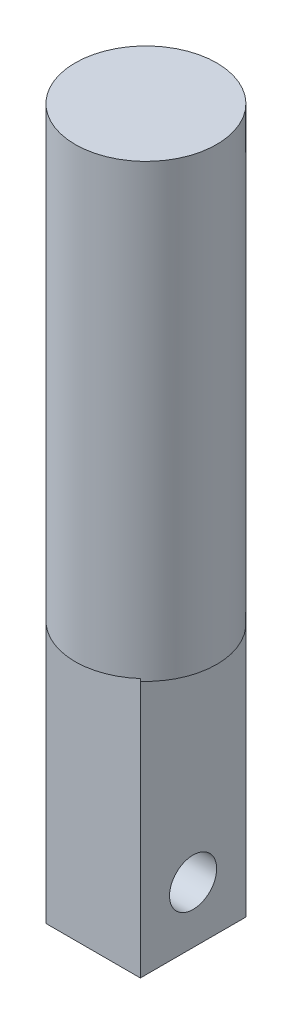
ISO-10303-21;
HEADER;
FILE_DESCRIPTION(('STEP AP214'),'2;1');
FILE_NAME('part.step','',(''),(''),'','','');
FILE_SCHEMA(('AUTOMOTIVE_DESIGN { 1 0 10303 214 1 1 1 1 }'));
ENDSEC;
DATA;
#1=APPLICATION_CONTEXT('core data for automotive mechanical design processes');
#2=APPLICATION_PROTOCOL_DEFINITION('international standard','automotive_design',2000,#1);
#3=PRODUCT_CONTEXT('',#1,'mechanical');
#4=PRODUCT('Part','Part','',(#3));
#5=PRODUCT_RELATED_PRODUCT_CATEGORY('part','',(#4));
#6=PRODUCT_DEFINITION_FORMATION('','',#4);
#7=PRODUCT_DEFINITION_CONTEXT('part definition',#1,'design');
#8=PRODUCT_DEFINITION('design','',#6,#7);
#9=PRODUCT_DEFINITION_SHAPE('','',#8);
#10=(LENGTH_UNIT() NAMED_UNIT(*) SI_UNIT(.MILLI.,.METRE.));
#11=(NAMED_UNIT(*) PLANE_ANGLE_UNIT() SI_UNIT($,.RADIAN.));
#12=(NAMED_UNIT(*) SI_UNIT($,.STERADIAN.) SOLID_ANGLE_UNIT());
#13=UNCERTAINTY_MEASURE_WITH_UNIT(LENGTH_MEASURE(1.E-05),#10,'distance_accuracy_value','');
#14=(GEOMETRIC_REPRESENTATION_CONTEXT(3) GLOBAL_UNCERTAINTY_ASSIGNED_CONTEXT((#13)) GLOBAL_UNIT_ASSIGNED_CONTEXT((#10,
#11,#12)) REPRESENTATION_CONTEXT('',''));
#15=CARTESIAN_POINT('',(0.,0.,0.));
#16=DIRECTION('',(0.,0.,1.));
#17=DIRECTION('',(1.,0.,0.));
#18=AXIS2_PLACEMENT_3D('',#15,#16,#17);
#19=CARTESIAN_POINT('',(0.,150.,0.));
#20=DIRECTION('',(0.,-1.,0.));
#21=DIRECTION('',(0.,0.,-1.));
#22=AXIS2_PLACEMENT_3D('',#19,#20,#21);
#23=CYLINDRICAL_SURFACE('',#22,15.);
#24=CARTESIAN_POINT('',(0.,150.,0.));
#25=DIRECTION('',(0.,1.,0.));
#26=DIRECTION('',(0.,0.,1.));
#27=AXIS2_PLACEMENT_3D('',#24,#25,#26);
#28=CIRCLE('',#27,15.);
#29=CARTESIAN_POINT('',(0.,150.,15.));
#30=VERTEX_POINT('',#29);
#31=EDGE_CURVE('E161',#30,#30,#28,.T.);
#32=ORIENTED_EDGE('',*,*,#31,.F.);
#33=EDGE_LOOP('',(#32));
#34=FACE_BOUND('',#33,.T.);
#35=CARTESIAN_POINT('',(0.,55.,0.));
#36=DIRECTION('',(0.,-1.,0.));
#37=DIRECTION('',(0.,0.,-1.));
#38=AXIS2_PLACEMENT_3D('',#35,#36,#37);
#39=CIRCLE('',#38,15.);
#40=CARTESIAN_POINT('',(-10.,55.,-11.1803398874989));
#41=VERTEX_POINT('',#40);
#42=CARTESIAN_POINT('',(10.,55.,-11.1803398874989));
#43=VERTEX_POINT('',#42);
#44=EDGE_CURVE('E97',#41,#43,#39,.T.);
#45=ORIENTED_EDGE('',*,*,#44,.F.);
#46=DIRECTION('',(0.,-1.,0.));
#47=VECTOR('',#46,1.);
#48=CARTESIAN_POINT('',(-10.,55.,-11.1803398874989));
#49=LINE('',#48,#47);
#50=CARTESIAN_POINT('',(-10.,54.4943570603394,-11.1803398874989));
#51=VERTEX_POINT('',#50);
#52=EDGE_CURVE('E109',#41,#51,#49,.T.);
#53=ORIENTED_EDGE('',*,*,#52,.T.);
#54=CARTESIAN_POINT('',(0.,54.4943570603394,0.));
#55=DIRECTION('',(0.,1.,0.));
#56=DIRECTION('',(0.,0.,1.));
#57=AXIS2_PLACEMENT_3D('',#54,#55,#56);
#58=CIRCLE('',#57,15.);
#59=CARTESIAN_POINT('',(-10.,54.4943570603394,11.1803398874989));
#60=VERTEX_POINT('',#59);
#61=EDGE_CURVE('E11',#51,#60,#58,.T.);
#62=ORIENTED_EDGE('',*,*,#61,.T.);
#63=DIRECTION('',(0.,-1.,0.));
#64=VECTOR('',#63,1.);
#65=CARTESIAN_POINT('',(-10.,55.,11.1803398874989));
#66=LINE('',#65,#64);
#67=CARTESIAN_POINT('',(-10.,55.,11.1803398874989));
#68=VERTEX_POINT('',#67);
#69=EDGE_CURVE('E66',#68,#60,#66,.T.);
#70=ORIENTED_EDGE('',*,*,#69,.F.);
#71=CARTESIAN_POINT('',(0.,55.,0.));
#72=DIRECTION('',(0.,-1.,0.));
#73=DIRECTION('',(0.,0.,-1.));
#74=AXIS2_PLACEMENT_3D('',#71,#72,#73);
#75=CIRCLE('',#74,15.);
#76=CARTESIAN_POINT('',(10.,55.,11.1803398874989));
#77=VERTEX_POINT('',#76);
#78=EDGE_CURVE('E132',#77,#68,#75,.T.);
#79=ORIENTED_EDGE('',*,*,#78,.F.);
#80=DIRECTION('',(0.,-1.,0.));
#81=VECTOR('',#80,1.);
#82=CARTESIAN_POINT('',(10.,55.,11.1803398874989));
#83=LINE('',#82,#81);
#84=CARTESIAN_POINT('',(10.,54.4943570603394,11.1803398874989));
#85=VERTEX_POINT('',#84);
#86=EDGE_CURVE('E126',#77,#85,#83,.T.);
#87=ORIENTED_EDGE('',*,*,#86,.T.);
#88=CARTESIAN_POINT('',(0.,54.4943570603394,0.));
#89=DIRECTION('',(0.,-1.,0.));
#90=DIRECTION('',(0.,0.,-1.));
#91=AXIS2_PLACEMENT_3D('',#88,#89,#90);
#92=CIRCLE('',#91,15.);
#93=CARTESIAN_POINT('',(10.,54.4943570603394,-11.1803398874989));
#94=VERTEX_POINT('',#93);
#95=EDGE_CURVE('E115',#94,#85,#92,.T.);
#96=ORIENTED_EDGE('',*,*,#95,.F.);
#97=DIRECTION('',(0.,-1.,0.));
#98=VECTOR('',#97,1.);
#99=CARTESIAN_POINT('',(10.,55.,-11.1803398874989));
#100=LINE('',#99,#98);
#101=EDGE_CURVE('E107',#43,#94,#100,.T.);
#102=ORIENTED_EDGE('',*,*,#101,.F.);
#103=EDGE_LOOP('',(#45,#53,#62,#70,#79,#87,#96,#102));
#104=FACE_BOUND('',#103,.T.);
#105=ADVANCED_FACE('F42',(#34,#104),#23,.T.);
#106=CARTESIAN_POINT('',(0.,0.,0.));
#107=DIRECTION('',(0.,1.,0.));
#108=DIRECTION('',(0.,0.,1.));
#109=AXIS2_PLACEMENT_3D('',#106,#107,#108);
#110=PLANE('',#109);
#111=DIRECTION('',(0.,0.,1.));
#112=VECTOR('',#111,1.);
#113=CARTESIAN_POINT('',(-10.,0.,0.));
#114=LINE('',#113,#112);
#115=CARTESIAN_POINT('',(-10.,0.,-11.1803398874989));
#116=VERTEX_POINT('',#115);
#117=CARTESIAN_POINT('',(-10.,0.,11.1803398874989));
#118=VERTEX_POINT('',#117);
#119=EDGE_CURVE('E51',#116,#118,#114,.T.);
#120=ORIENTED_EDGE('',*,*,#119,.F.);
#121=DIRECTION('',(-1.,0.,0.));
#122=VECTOR('',#121,1.);
#123=CARTESIAN_POINT('',(-10.,0.,-11.1803398874989));
#124=LINE('',#123,#122);
#125=CARTESIAN_POINT('',(10.,0.,-11.1803398874989));
#126=VERTEX_POINT('',#125);
#127=EDGE_CURVE('E58',#126,#116,#124,.T.);
#128=ORIENTED_EDGE('',*,*,#127,.F.);
#129=DIRECTION('',(0.,0.,1.));
#130=VECTOR('',#129,1.);
#131=CARTESIAN_POINT('',(10.,0.,0.));
#132=LINE('',#131,#130);
#133=CARTESIAN_POINT('',(10.,0.,11.1803398874989));
#134=VERTEX_POINT('',#133);
#135=EDGE_CURVE('E165',#126,#134,#132,.T.);
#136=ORIENTED_EDGE('',*,*,#135,.T.);
#137=DIRECTION('',(1.,0.,0.));
#138=VECTOR('',#137,1.);
#139=CARTESIAN_POINT('',(-10.,0.,11.1803398874989));
#140=LINE('',#139,#138);
#141=EDGE_CURVE('E129',#118,#134,#140,.T.);
#142=ORIENTED_EDGE('',*,*,#141,.F.);
#143=EDGE_LOOP('',(#120,#128,#136,#142));
#144=FACE_BOUND('',#143,.T.);
#145=ADVANCED_FACE('F179',(#144),#110,.F.);
#146=CARTESIAN_POINT('',(0.,150.,0.));
#147=DIRECTION('',(0.,1.,0.));
#148=DIRECTION('',(0.,0.,1.));
#149=AXIS2_PLACEMENT_3D('',#146,#147,#148);
#150=PLANE('',#149);
#151=ORIENTED_EDGE('',*,*,#31,.T.);
#152=EDGE_LOOP('',(#151));
#153=FACE_BOUND('',#152,.T.);
#154=ADVANCED_FACE('F189',(#153),#150,.T.);
#155=CARTESIAN_POINT('',(110.,54.4943570603394,15.));
#156=DIRECTION('',(0.,-1.,0.));
#157=DIRECTION('',(0.,0.,-1.));
#158=AXIS2_PLACEMENT_3D('',#155,#156,#157);
#159=PLANE('',#158);
#160=ORIENTED_EDGE('',*,*,#95,.T.);
#161=DIRECTION('',(0.,0.,1.));
#162=VECTOR('',#161,1.);
#163=CARTESIAN_POINT('',(10.,54.4943570603394,15.));
#164=LINE('',#163,#162);
#165=EDGE_CURVE('E151',#94,#85,#164,.T.);
#166=ORIENTED_EDGE('',*,*,#165,.F.);
#167=EDGE_LOOP('',(#160,#166));
#168=FACE_BOUND('',#167,.T.);
#169=ADVANCED_FACE('F187',(#168),#159,.T.);
#170=CARTESIAN_POINT('',(10.,0.,0.));
#171=DIRECTION('',(-1.,0.,0.));
#172=DIRECTION('',(0.,0.,1.));
#173=AXIS2_PLACEMENT_3D('',#170,#171,#172);
#174=PLANE('',#173);
#175=CARTESIAN_POINT('',(10.,12.,-0.000339887498942634));
#176=DIRECTION('',(1.,0.,0.));
#177=DIRECTION('',(0.,0.,-1.));
#178=AXIS2_PLACEMENT_3D('',#175,#176,#177);
#179=CIRCLE('',#178,5.);
#180=CARTESIAN_POINT('',(10.,12.,-5.00033988749895));
#181=VERTEX_POINT('',#180);
#182=EDGE_CURVE('E119',#181,#181,#179,.T.);
#183=ORIENTED_EDGE('',*,*,#182,.F.);
#184=EDGE_LOOP('',(#183));
#185=FACE_BOUND('',#184,.T.);
#186=ORIENTED_EDGE('',*,*,#165,.T.);
#187=DIRECTION('',(0.,-1.,0.));
#188=VECTOR('',#187,1.);
#189=CARTESIAN_POINT('',(10.,150.,11.1803398874989));
#190=LINE('',#189,#188);
#191=EDGE_CURVE('E155',#134,#85,#190,.F.);
#192=ORIENTED_EDGE('',*,*,#191,.F.);
#193=ORIENTED_EDGE('',*,*,#135,.F.);
#194=DIRECTION('',(0.,-1.,0.));
#195=VECTOR('',#194,1.);
#196=CARTESIAN_POINT('',(10.,150.,-11.1803398874989));
#197=LINE('',#196,#195);
#198=EDGE_CURVE('E158',#94,#126,#197,.T.);
#199=ORIENTED_EDGE('',*,*,#198,.F.);
#200=EDGE_LOOP('',(#186,#192,#193,#199));
#201=FACE_BOUND('',#200,.T.);
#202=ADVANCED_FACE('F184',(#185,#201),#174,.F.);
#203=CARTESIAN_POINT('',(-110.,54.4943570603394,15.));
#204=DIRECTION('',(0.,1.,0.));
#205=DIRECTION('',(0.,0.,1.));
#206=AXIS2_PLACEMENT_3D('',#203,#204,#205);
#207=PLANE('',#206);
#208=DIRECTION('',(0.,0.,1.));
#209=VECTOR('',#208,1.);
#210=CARTESIAN_POINT('',(-10.,54.4943570603394,15.));
#211=LINE('',#210,#209);
#212=EDGE_CURVE('E141',#51,#60,#211,.T.);
#213=ORIENTED_EDGE('',*,*,#212,.T.);
#214=ORIENTED_EDGE('',*,*,#61,.F.);
#215=EDGE_LOOP('',(#213,#214));
#216=FACE_BOUND('',#215,.T.);
#217=ADVANCED_FACE('F195',(#216),#207,.F.);
#218=CARTESIAN_POINT('',(-10.,0.,0.));
#219=DIRECTION('',(-1.,0.,0.));
#220=DIRECTION('',(0.,0.,1.));
#221=AXIS2_PLACEMENT_3D('',#218,#219,#220);
#222=PLANE('',#221);
#223=CARTESIAN_POINT('',(-9.99999999999999,12.,-0.000339887498942634));
#224=DIRECTION('',(-1.,0.,0.));
#225=DIRECTION('',(0.,0.,1.));
#226=AXIS2_PLACEMENT_3D('',#223,#224,#225);
#227=CIRCLE('',#226,5.);
#228=CARTESIAN_POINT('',(-9.99999999999999,12.,4.99966011250106));
#229=VERTEX_POINT('',#228);
#230=EDGE_CURVE('E45',#229,#229,#227,.T.);
#231=ORIENTED_EDGE('',*,*,#230,.F.);
#232=EDGE_LOOP('',(#231));
#233=FACE_BOUND('',#232,.T.);
#234=DIRECTION('',(0.,-1.,0.));
#235=VECTOR('',#234,1.);
#236=CARTESIAN_POINT('',(-10.,150.,-11.1803398874989));
#237=LINE('',#236,#235);
#238=EDGE_CURVE('E148',#51,#116,#237,.T.);
#239=ORIENTED_EDGE('',*,*,#238,.T.);
#240=ORIENTED_EDGE('',*,*,#119,.T.);
#241=DIRECTION('',(0.,-1.,0.));
#242=VECTOR('',#241,1.);
#243=CARTESIAN_POINT('',(-10.,150.,11.1803398874989));
#244=LINE('',#243,#242);
#245=EDGE_CURVE('E145',#118,#60,#244,.F.);
#246=ORIENTED_EDGE('',*,*,#245,.T.);
#247=ORIENTED_EDGE('',*,*,#212,.F.);
#248=EDGE_LOOP('',(#239,#240,#246,#247));
#249=FACE_BOUND('',#248,.T.);
#250=ADVANCED_FACE('F175',(#233,#249),#222,.T.);
#251=CARTESIAN_POINT('',(-90.,12.,-0.000339887498942634));
#252=DIRECTION('',(1.,0.,0.));
#253=DIRECTION('',(0.,0.,-1.));
#254=AXIS2_PLACEMENT_3D('',#251,#252,#253);
#255=CYLINDRICAL_SURFACE('',#254,5.);
#256=ORIENTED_EDGE('',*,*,#230,.T.);
#257=EDGE_LOOP('',(#256));
#258=FACE_BOUND('',#257,.T.);
#259=ORIENTED_EDGE('',*,*,#182,.T.);
#260=EDGE_LOOP('',(#259));
#261=FACE_BOUND('',#260,.T.);
#262=ADVANCED_FACE('F247',(#258,#261),#255,.F.);
#263=CARTESIAN_POINT('',(-10.,55.,11.1803398874989));
#264=DIRECTION('',(0.,0.,-1.));
#265=DIRECTION('',(-1.,0.,0.));
#266=AXIS2_PLACEMENT_3D('',#263,#264,#265);
#267=PLANE('',#266);
#268=ORIENTED_EDGE('',*,*,#141,.T.);
#269=ORIENTED_EDGE('',*,*,#191,.T.);
#270=ORIENTED_EDGE('',*,*,#86,.F.);
#271=DIRECTION('',(1.,0.,0.));
#272=VECTOR('',#271,1.);
#273=CARTESIAN_POINT('',(-10.,55.,11.1803398874989));
#274=LINE('',#273,#272);
#275=EDGE_CURVE('E125',#68,#77,#274,.T.);
#276=ORIENTED_EDGE('',*,*,#275,.F.);
#277=ORIENTED_EDGE('',*,*,#69,.T.);
#278=ORIENTED_EDGE('',*,*,#245,.F.);
#279=EDGE_LOOP('',(#268,#269,#270,#276,#277,#278));
#280=FACE_BOUND('',#279,.T.);
#281=ADVANCED_FACE('F182',(#280),#267,.F.);
#282=CARTESIAN_POINT('',(0.,55.,0.));
#283=DIRECTION('',(0.,-1.,0.));
#284=DIRECTION('',(0.,0.,-1.));
#285=AXIS2_PLACEMENT_3D('',#282,#283,#284);
#286=PLANE('',#285);
#287=ORIENTED_EDGE('',*,*,#78,.T.);
#288=ORIENTED_EDGE('',*,*,#275,.T.);
#289=EDGE_LOOP('',(#287,#288));
#290=FACE_BOUND('',#289,.T.);
#291=ADVANCED_FACE('F263',(#290),#286,.T.);
#292=CARTESIAN_POINT('',(-10.,55.,-11.1803398874989));
#293=DIRECTION('',(0.,0.,1.));
#294=DIRECTION('',(1.,0.,0.));
#295=AXIS2_PLACEMENT_3D('',#292,#293,#294);
#296=PLANE('',#295);
#297=ORIENTED_EDGE('',*,*,#127,.T.);
#298=ORIENTED_EDGE('',*,*,#238,.F.);
#299=ORIENTED_EDGE('',*,*,#52,.F.);
#300=DIRECTION('',(-1.,0.,0.));
#301=VECTOR('',#300,1.);
#302=CARTESIAN_POINT('',(-10.,55.,-11.1803398874989));
#303=LINE('',#302,#301);
#304=EDGE_CURVE('E100',#43,#41,#303,.T.);
#305=ORIENTED_EDGE('',*,*,#304,.F.);
#306=ORIENTED_EDGE('',*,*,#101,.T.);
#307=ORIENTED_EDGE('',*,*,#198,.T.);
#308=EDGE_LOOP('',(#297,#298,#299,#305,#306,#307));
#309=FACE_BOUND('',#308,.T.);
#310=ADVANCED_FACE('F106',(#309),#296,.F.);
#311=CARTESIAN_POINT('',(0.,55.,0.));
#312=DIRECTION('',(0.,-1.,0.));
#313=DIRECTION('',(0.,0.,-1.));
#314=AXIS2_PLACEMENT_3D('',#311,#312,#313);
#315=PLANE('',#314);
#316=ORIENTED_EDGE('',*,*,#44,.T.);
#317=ORIENTED_EDGE('',*,*,#304,.T.);
#318=EDGE_LOOP('',(#316,#317));
#319=FACE_BOUND('',#318,.T.);
#320=ADVANCED_FACE('F99',(#319),#315,.T.);
#321=CLOSED_SHELL('',(#105,#145,#154,#169,#202,#217,#250,#262,#281,#291,#310,#320));
#322=MANIFOLD_SOLID_BREP('B2',#321);
#323=ADVANCED_BREP_SHAPE_REPRESENTATION('',(#18,#322),#14);
#324=SHAPE_DEFINITION_REPRESENTATION(#9,#323);
ENDSEC;
END-ISO-10303-21;
